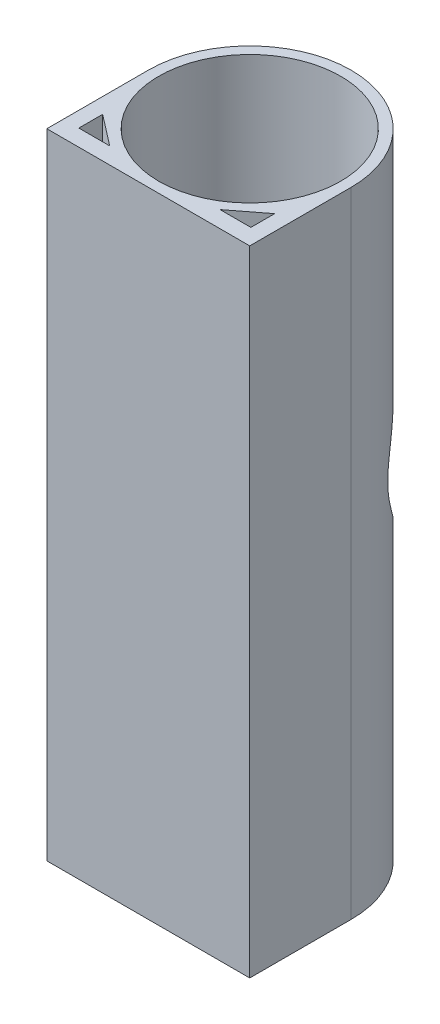
ISO-10303-21;
HEADER;
FILE_DESCRIPTION(('STEP AP214'),'2;1');
FILE_NAME('part.step','',(''),(''),'','','');
FILE_SCHEMA(('AUTOMOTIVE_DESIGN { 1 0 10303 214 1 1 1 1 }'));
ENDSEC;
DATA;
#1=APPLICATION_CONTEXT('core data for automotive mechanical design processes');
#2=APPLICATION_PROTOCOL_DEFINITION('international standard','automotive_design',2000,#1);
#3=PRODUCT_CONTEXT('',#1,'mechanical');
#4=PRODUCT('Part','Part','',(#3));
#5=PRODUCT_RELATED_PRODUCT_CATEGORY('part','',(#4));
#6=PRODUCT_DEFINITION_FORMATION('','',#4);
#7=PRODUCT_DEFINITION_CONTEXT('part definition',#1,'design');
#8=PRODUCT_DEFINITION('design','',#6,#7);
#9=PRODUCT_DEFINITION_SHAPE('','',#8);
#10=(LENGTH_UNIT() NAMED_UNIT(*) SI_UNIT(.MILLI.,.METRE.));
#11=(NAMED_UNIT(*) PLANE_ANGLE_UNIT() SI_UNIT($,.RADIAN.));
#12=(NAMED_UNIT(*) SI_UNIT($,.STERADIAN.) SOLID_ANGLE_UNIT());
#13=UNCERTAINTY_MEASURE_WITH_UNIT(LENGTH_MEASURE(1.E-05),#10,'distance_accuracy_value','');
#14=(GEOMETRIC_REPRESENTATION_CONTEXT(3) GLOBAL_UNCERTAINTY_ASSIGNED_CONTEXT((#13)) GLOBAL_UNIT_ASSIGNED_CONTEXT((#10,
#11,#12)) REPRESENTATION_CONTEXT('',''));
#15=CARTESIAN_POINT('',(0.,0.,0.));
#16=DIRECTION('',(0.,0.,1.));
#17=DIRECTION('',(1.,0.,0.));
#18=AXIS2_PLACEMENT_3D('',#15,#16,#17);
#19=CARTESIAN_POINT('',(0.,100.,0.));
#20=DIRECTION('',(0.,1.,0.));
#21=DIRECTION('',(0.,0.,1.));
#22=AXIS2_PLACEMENT_3D('',#19,#20,#21);
#23=PLANE('',#22);
#24=DIRECTION('',(1.,0.,0.));
#25=VECTOR('',#24,1.);
#26=CARTESIAN_POINT('',(-13.5669608350879,100.,13.3875277919854));
#27=LINE('',#26,#25);
#28=CARTESIAN_POINT('',(-13.5669608350879,100.,13.3875277919854));
#29=VERTEX_POINT('',#28);
#30=CARTESIAN_POINT('',(-8.70003196903027,100.,13.3875277919854));
#31=VERTEX_POINT('',#30);
#32=EDGE_CURVE('E229',#29,#31,#27,.T.);
#33=ORIENTED_EDGE('',*,*,#32,.F.);
#34=DIRECTION('',(0.,0.,1.));
#35=VECTOR('',#34,1.);
#36=CARTESIAN_POINT('',(-13.5669608350879,100.,9.63117329804829));
#37=LINE('',#36,#35);
#38=CARTESIAN_POINT('',(-13.5669608350879,100.,9.63117329804829));
#39=VERTEX_POINT('',#38);
#40=EDGE_CURVE('E226',#39,#29,#37,.T.);
#41=ORIENTED_EDGE('',*,*,#40,.F.);
#42=DIRECTION('',(-0.791635404937804,0.,-0.610993768911728));
#43=VECTOR('',#42,1.);
#44=CARTESIAN_POINT('',(-8.70003196903027,100.,13.3875277919854));
#45=LINE('',#44,#43);
#46=EDGE_CURVE('E234',#31,#39,#45,.T.);
#47=ORIENTED_EDGE('',*,*,#46,.F.);
#48=EDGE_LOOP('',(#33,#41,#47));
#49=FACE_BOUND('',#48,.T.);
#50=CARTESIAN_POINT('',(0.,100.,0.));
#51=DIRECTION('',(0.,1.,0.));
#52=DIRECTION('',(0.,0.,1.));
#53=AXIS2_PLACEMENT_3D('',#50,#51,#52);
#54=CIRCLE('',#53,16.);
#55=CARTESIAN_POINT('',(16.,100.,0.));
#56=VERTEX_POINT('',#55);
#57=CARTESIAN_POINT('',(-16.,100.,0.));
#58=VERTEX_POINT('',#57);
#59=EDGE_CURVE('E259',#56,#58,#54,.T.);
#60=ORIENTED_EDGE('',*,*,#59,.T.);
#61=DIRECTION('',(0.,0.,1.));
#62=VECTOR('',#61,1.);
#63=CARTESIAN_POINT('',(-16.,100.,16.));
#64=LINE('',#63,#62);
#65=CARTESIAN_POINT('',(-16.,100.,16.));
#66=VERTEX_POINT('',#65);
#67=EDGE_CURVE('E263',#58,#66,#64,.T.);
#68=ORIENTED_EDGE('',*,*,#67,.T.);
#69=DIRECTION('',(1.,0.,0.));
#70=VECTOR('',#69,1.);
#71=CARTESIAN_POINT('',(16.,100.,16.));
#72=LINE('',#71,#70);
#73=CARTESIAN_POINT('',(16.,100.,16.));
#74=VERTEX_POINT('',#73);
#75=EDGE_CURVE('E267',#66,#74,#72,.T.);
#76=ORIENTED_EDGE('',*,*,#75,.T.);
#77=DIRECTION('',(0.,0.,-1.));
#78=VECTOR('',#77,1.);
#79=CARTESIAN_POINT('',(16.,100.,16.));
#80=LINE('',#79,#78);
#81=EDGE_CURVE('E270',#74,#56,#80,.T.);
#82=ORIENTED_EDGE('',*,*,#81,.T.);
#83=EDGE_LOOP('',(#60,#68,#76,#82));
#84=FACE_BOUND('',#83,.T.);
#85=CARTESIAN_POINT('',(0.,100.,0.));
#86=DIRECTION('',(0.,1.,0.));
#87=DIRECTION('',(0.,0.,1.));
#88=AXIS2_PLACEMENT_3D('',#85,#86,#87);
#89=CIRCLE('',#88,14.35);
#90=CARTESIAN_POINT('',(0.,100.,14.35));
#91=VERTEX_POINT('',#90);
#92=EDGE_CURVE('E218',#91,#91,#89,.T.);
#93=ORIENTED_EDGE('',*,*,#92,.F.);
#94=EDGE_LOOP('',(#93));
#95=FACE_BOUND('',#94,.T.);
#96=DIRECTION('',(-0.791635404937804,0.,0.610993768911728));
#97=VECTOR('',#96,1.);
#98=CARTESIAN_POINT('',(8.70003196903027,100.,13.3875277919854));
#99=LINE('',#98,#97);
#100=CARTESIAN_POINT('',(13.5669608350879,100.,9.63117329804829));
#101=VERTEX_POINT('',#100);
#102=CARTESIAN_POINT('',(8.70003196903027,100.,13.3875277919854));
#103=VERTEX_POINT('',#102);
#104=EDGE_CURVE('E190',#101,#103,#99,.T.);
#105=ORIENTED_EDGE('',*,*,#104,.F.);
#106=DIRECTION('',(0.,0.,-1.));
#107=VECTOR('',#106,1.);
#108=CARTESIAN_POINT('',(13.5669608350879,100.,9.63117329804829));
#109=LINE('',#108,#107);
#110=CARTESIAN_POINT('',(13.5669608350879,100.,13.3875277919854));
#111=VERTEX_POINT('',#110);
#112=EDGE_CURVE('E187',#111,#101,#109,.T.);
#113=ORIENTED_EDGE('',*,*,#112,.F.);
#114=DIRECTION('',(1.,0.,0.));
#115=VECTOR('',#114,1.);
#116=CARTESIAN_POINT('',(13.5669608350879,100.,13.3875277919854));
#117=LINE('',#116,#115);
#118=EDGE_CURVE('E194',#103,#111,#117,.T.);
#119=ORIENTED_EDGE('',*,*,#118,.F.);
#120=EDGE_LOOP('',(#105,#113,#119));
#121=FACE_BOUND('',#120,.T.);
#122=ADVANCED_FACE('F44',(#49,#84,#95,#121),#23,.T.);
#123=CARTESIAN_POINT('',(0.,0.,0.));
#124=DIRECTION('',(0.,1.,0.));
#125=DIRECTION('',(0.,0.,1.));
#126=AXIS2_PLACEMENT_3D('',#123,#124,#125);
#127=PLANE('',#126);
#128=CARTESIAN_POINT('',(0.,0.,0.));
#129=DIRECTION('',(0.,1.,0.));
#130=DIRECTION('',(0.,0.,1.));
#131=AXIS2_PLACEMENT_3D('',#128,#129,#130);
#132=CIRCLE('',#131,14.35);
#133=CARTESIAN_POINT('',(0.,0.,14.35));
#134=VERTEX_POINT('',#133);
#135=EDGE_CURVE('E217',#134,#134,#132,.T.);
#136=ORIENTED_EDGE('',*,*,#135,.T.);
#137=EDGE_LOOP('',(#136));
#138=FACE_BOUND('',#137,.T.);
#139=DIRECTION('',(0.,0.,1.));
#140=VECTOR('',#139,1.);
#141=CARTESIAN_POINT('',(-13.5669608350879,0.,9.63117329804829));
#142=LINE('',#141,#140);
#143=CARTESIAN_POINT('',(-13.5669608350879,0.,9.63117329804829));
#144=VERTEX_POINT('',#143);
#145=CARTESIAN_POINT('',(-13.5669608350879,0.,13.3875277919854));
#146=VERTEX_POINT('',#145);
#147=EDGE_CURVE('E222',#144,#146,#142,.T.);
#148=ORIENTED_EDGE('',*,*,#147,.T.);
#149=DIRECTION('',(1.,0.,0.));
#150=VECTOR('',#149,1.);
#151=CARTESIAN_POINT('',(-13.5669608350879,0.,13.3875277919854));
#152=LINE('',#151,#150);
#153=CARTESIAN_POINT('',(-8.70003196903027,0.,13.3875277919854));
#154=VERTEX_POINT('',#153);
#155=EDGE_CURVE('E241',#146,#154,#152,.T.);
#156=ORIENTED_EDGE('',*,*,#155,.T.);
#157=DIRECTION('',(-0.791635404937804,0.,-0.610993768911728));
#158=VECTOR('',#157,1.);
#159=CARTESIAN_POINT('',(-8.70003196903027,0.,13.3875277919854));
#160=LINE('',#159,#158);
#161=EDGE_CURVE('E230',#154,#144,#160,.T.);
#162=ORIENTED_EDGE('',*,*,#161,.T.);
#163=EDGE_LOOP('',(#148,#156,#162));
#164=FACE_BOUND('',#163,.T.);
#165=CARTESIAN_POINT('',(0.,0.,0.));
#166=DIRECTION('',(0.,1.,0.));
#167=DIRECTION('',(0.,0.,1.));
#168=AXIS2_PLACEMENT_3D('',#165,#166,#167);
#169=CIRCLE('',#168,16.);
#170=CARTESIAN_POINT('',(16.,0.,0.));
#171=VERTEX_POINT('',#170);
#172=CARTESIAN_POINT('',(-16.,0.,0.));
#173=VERTEX_POINT('',#172);
#174=EDGE_CURVE('E258',#171,#173,#169,.T.);
#175=ORIENTED_EDGE('',*,*,#174,.F.);
#176=DIRECTION('',(0.,0.,-1.));
#177=VECTOR('',#176,1.);
#178=CARTESIAN_POINT('',(16.,0.,16.));
#179=LINE('',#178,#177);
#180=CARTESIAN_POINT('',(16.,0.,16.));
#181=VERTEX_POINT('',#180);
#182=EDGE_CURVE('E264',#181,#171,#179,.T.);
#183=ORIENTED_EDGE('',*,*,#182,.F.);
#184=DIRECTION('',(1.,0.,0.));
#185=VECTOR('',#184,1.);
#186=CARTESIAN_POINT('',(16.,0.,16.));
#187=LINE('',#186,#185);
#188=CARTESIAN_POINT('',(-16.,0.,16.));
#189=VERTEX_POINT('',#188);
#190=EDGE_CURVE('E280',#189,#181,#187,.T.);
#191=ORIENTED_EDGE('',*,*,#190,.F.);
#192=DIRECTION('',(0.,0.,1.));
#193=VECTOR('',#192,1.);
#194=CARTESIAN_POINT('',(-16.,0.,16.));
#195=LINE('',#194,#193);
#196=EDGE_CURVE('E277',#173,#189,#195,.T.);
#197=ORIENTED_EDGE('',*,*,#196,.F.);
#198=EDGE_LOOP('',(#175,#183,#191,#197));
#199=FACE_BOUND('',#198,.T.);
#200=DIRECTION('',(0.,0.,-1.));
#201=VECTOR('',#200,1.);
#202=CARTESIAN_POINT('',(13.5669608350879,0.,9.63117329804829));
#203=LINE('',#202,#201);
#204=CARTESIAN_POINT('',(13.5669608350879,0.,13.3875277919854));
#205=VERTEX_POINT('',#204);
#206=CARTESIAN_POINT('',(13.5669608350879,0.,9.63117329804829));
#207=VERTEX_POINT('',#206);
#208=EDGE_CURVE('E186',#205,#207,#203,.T.);
#209=ORIENTED_EDGE('',*,*,#208,.T.);
#210=DIRECTION('',(-0.791635404937804,0.,0.610993768911728));
#211=VECTOR('',#210,1.);
#212=CARTESIAN_POINT('',(8.70003196903027,0.,13.3875277919854));
#213=LINE('',#212,#211);
#214=CARTESIAN_POINT('',(8.70003196903027,0.,13.3875277919854));
#215=VERTEX_POINT('',#214);
#216=EDGE_CURVE('E201',#207,#215,#213,.T.);
#217=ORIENTED_EDGE('',*,*,#216,.T.);
#218=DIRECTION('',(1.,0.,0.));
#219=VECTOR('',#218,1.);
#220=CARTESIAN_POINT('',(13.5669608350879,0.,13.3875277919854));
#221=LINE('',#220,#219);
#222=EDGE_CURVE('E191',#215,#205,#221,.T.);
#223=ORIENTED_EDGE('',*,*,#222,.T.);
#224=EDGE_LOOP('',(#209,#217,#223));
#225=FACE_BOUND('',#224,.T.);
#226=ADVANCED_FACE('F307',(#138,#164,#199,#225),#127,.F.);
#227=CARTESIAN_POINT('',(0.,100.,0.));
#228=DIRECTION('',(0.,-1.,0.));
#229=DIRECTION('',(0.,0.,-1.));
#230=AXIS2_PLACEMENT_3D('',#227,#228,#229);
#231=CYLINDRICAL_SURFACE('',#230,16.);
#232=CARTESIAN_POINT('',(13.97,54.8665766190309,-7.79994230747894));
#233=CARTESIAN_POINT('',(13.9699985237487,55.0924436285875,-7.79994678112236));
#234=CARTESIAN_POINT('',(13.9645059640299,55.3183341278107,-7.80980728983225));
#235=CARTESIAN_POINT('',(13.9427097144403,55.7679314810345,-7.84865090592604));
#236=CARTESIAN_POINT('',(13.9264041942972,55.9916379588473,-7.87763725066971));
#237=CARTESIAN_POINT('',(13.8834081599857,56.435571176954,-7.95316616355446));
#238=CARTESIAN_POINT('',(13.8566925015884,56.6557881383162,-7.99975123056548));
#239=CARTESIAN_POINT('',(13.7935171195082,57.0910302511006,-8.10819426029293));
#240=CARTESIAN_POINT('',(13.7570531652828,57.3060531041155,-8.17005885309227));
#241=CARTESIAN_POINT('',(13.6569937133938,57.8236444650212,-8.33664386691138));
#242=CARTESIAN_POINT('',(13.5885221322852,58.1230560590729,-8.44823832362587));
#243=CARTESIAN_POINT('',(13.4345344348691,58.7092530382128,-8.69102694121135));
#244=CARTESIAN_POINT('',(13.3490085457503,58.9960310681809,-8.82223232909672));
#245=CARTESIAN_POINT('',(13.1619425924148,59.5582938902496,-9.09896936023355));
#246=CARTESIAN_POINT('',(13.0603538253724,59.8337410179924,-9.24454404995238));
#247=CARTESIAN_POINT('',(12.8422409571158,60.3731500219468,-9.54522932659498));
#248=CARTESIAN_POINT('',(12.725718066221,60.637112826573,-9.70033914022581));
#249=CARTESIAN_POINT('',(12.4061460865559,61.3050964889276,-10.1088233053283));
#250=CARTESIAN_POINT('',(12.1922318788411,61.701138817384,-10.3668079484495));
#251=CARTESIAN_POINT('',(11.7291077251626,62.4685344818749,-10.8880623607562));
#252=CARTESIAN_POINT('',(11.4798788791036,62.8398744400059,-11.151334894798));
#253=CARTESIAN_POINT('',(10.9464777037523,63.5576758990754,-11.6753716238256));
#254=CARTESIAN_POINT('',(10.6623423514044,63.9041631208136,-11.9361381629441));
#255=CARTESIAN_POINT('',(10.0586795296777,64.5715313620494,-12.4490879429243));
#256=CARTESIAN_POINT('',(9.73916787087285,64.8924237111118,-12.7012749528437));
#257=CARTESIAN_POINT('',(9.14200083802388,65.4357796991152,-13.1349520760161));
#258=CARTESIAN_POINT('',(8.87160955558304,65.6639119413956,-13.3193665785709));
#259=CARTESIAN_POINT('',(8.3095984164467,66.1021642217615,-13.677042305285));
#260=CARTESIAN_POINT('',(8.01797914218122,66.3122847536881,-13.8503038352015));
#261=CARTESIAN_POINT('',(7.41421115307583,66.7123068889453,-14.1826678748009));
#262=CARTESIAN_POINT('',(7.10209119311432,66.9022358735348,-14.3417895098838));
#263=CARTESIAN_POINT('',(6.45767416343106,67.2599239654261,-14.6432542800723));
#264=CARTESIAN_POINT('',(6.12538117215214,67.4276875323364,-14.7856007896529));
#265=CARTESIAN_POINT('',(5.5056776747206,67.7095394544941,-15.0258588918648));
#266=CARTESIAN_POINT('',(5.22145419556399,67.8278030747469,-15.1271064961066));
#267=CARTESIAN_POINT('',(4.64159151896136,68.0465806096864,-15.3149750564337));
#268=CARTESIAN_POINT('',(4.34595466754171,68.1470981486676,-15.401598998961));
#269=CARTESIAN_POINT('',(3.74475621366635,68.328979340513,-15.5587045762324));
#270=CARTESIAN_POINT('',(3.43919808362299,68.410349614346,-15.6291917906967));
#271=CARTESIAN_POINT('',(2.81987946290949,68.5527053544679,-15.7527129995874));
#272=CARTESIAN_POINT('',(2.50611888164942,68.6136905955167,-15.805746801166));
#273=CARTESIAN_POINT('',(1.87093185060101,68.714480845421,-15.8934870947554));
#274=CARTESIAN_POINT('',(1.54947365799771,68.7541722514015,-15.928095278561));
#275=CARTESIAN_POINT('',(0.903064786182122,68.8111324518246,-15.9777827877118));
#276=CARTESIAN_POINT('',(0.578114099118067,68.8284011958463,-15.9928620691431));
#277=CARTESIAN_POINT('',(-0.0724680407355863,68.8401761855407,-16.0031427137755));
#278=CARTESIAN_POINT('',(-0.398099389979445,68.8346856726972,-15.9983469076829));
#279=CARTESIAN_POINT('',(-1.04727773368454,68.8010567816269,-15.968994004122));
#280=CARTESIAN_POINT('',(-1.3708248358688,68.7729195835018,-15.944437936346));
#281=CARTESIAN_POINT('',(-1.98603295351651,68.6978587221269,-15.879016323026));
#282=CARTESIAN_POINT('',(-2.27808088232999,68.652720580978,-15.8397017959235));
#283=CARTESIAN_POINT('',(-2.85631337984338,68.5446201666632,-15.745706157139));
#284=CARTESIAN_POINT('',(-3.1424983504028,68.4816591195297,-15.6910261024489));
#285=CARTESIAN_POINT('',(-3.70741972767434,68.3388015213647,-15.5672307640638));
#286=CARTESIAN_POINT('',(-3.98615560391669,68.2589037678251,-15.4981144553983));
#287=CARTESIAN_POINT('',(-4.53483734744374,68.083200579306,-15.3465395242616));
#288=CARTESIAN_POINT('',(-4.80478267075646,67.9873941621046,-15.2640800779756));
#289=CARTESIAN_POINT('',(-5.35305085050942,67.7738669732234,-15.0809160026481));
#290=CARTESIAN_POINT('',(-5.63067354105304,67.6550923614836,-14.9793467170727));
#291=CARTESIAN_POINT('',(-6.17380991477573,67.4019186073852,-14.7637898083503));
#292=CARTESIAN_POINT('',(-6.43931879578762,67.2675133423653,-14.6497973200347));
#293=CARTESIAN_POINT('',(-6.95752030035005,66.9843735955445,-14.4109098678718));
#294=CARTESIAN_POINT('',(-7.21021075202144,66.8356366977726,-14.2860130661521));
#295=CARTESIAN_POINT('',(-7.70235917723859,66.5250186959574,-14.0267977819284));
#296=CARTESIAN_POINT('',(-7.94181440150156,66.3631348780916,-13.8924773549573));
#297=CARTESIAN_POINT('',(-8.52725760670458,65.9406886237687,-13.5445250281677));
#298=CARTESIAN_POINT('',(-8.86453826838918,65.6722725481025,-13.3256990621171));
#299=CARTESIAN_POINT('',(-9.50803408132681,65.1106356857059,-12.874464779812));
#300=CARTESIAN_POINT('',(-9.81423474779551,64.8174034491217,-12.6420502094091));
#301=CARTESIAN_POINT('',(-10.3964281123429,64.2075280371138,-12.167808869214));
#302=CARTESIAN_POINT('',(-10.6723411292202,63.8908266156015,-11.925959438862));
#303=CARTESIAN_POINT('',(-11.1932906211576,63.235938902689,-11.4384183242691));
#304=CARTESIAN_POINT('',(-11.4383353821597,62.8977584137186,-11.1927276911102));
#305=CARTESIAN_POINT('',(-11.863615531859,62.2518321509213,-10.7394761000152));
#306=CARTESIAN_POINT('',(-12.0480711843244,61.947025689152,-10.5316715270431));
#307=CARTESIAN_POINT('',(-12.3946155699113,61.321217658118,-10.1215380116039));
#308=CARTESIAN_POINT('',(-12.5566984156489,61.0002118562441,-9.91921052164352));
#309=CARTESIAN_POINT('',(-12.8573920240015,60.3418865450607,-9.52620044676728));
#310=CARTESIAN_POINT('',(-12.9960666887165,60.0046147904269,-9.33548709819877));
#311=CARTESIAN_POINT('',(-13.2491313195712,59.3115015438118,-8.97269636527639));
#312=CARTESIAN_POINT('',(-13.3635418269399,58.9556760793305,-8.80060327857907));
#313=CARTESIAN_POINT('',(-13.5192852169626,58.3924470548835,-8.55799292356975));
#314=CARTESIAN_POINT('',(-13.5700251137269,58.1920589169846,-8.47716467055808));
#315=CARTESIAN_POINT('',(-13.6632697369306,57.7853918459385,-8.32603894018462));
#316=CARTESIAN_POINT('',(-13.7057734485503,57.5791121904575,-8.25574276077162));
#317=CARTESIAN_POINT('',(-13.7818581763614,57.1614064134984,-8.12809401831235));
#318=CARTESIAN_POINT('',(-13.8154572952183,56.9499917021535,-8.07071523108295));
#319=CARTESIAN_POINT('',(-13.8731946223363,56.522433527169,-7.9710600766854));
#320=CARTESIAN_POINT('',(-13.8973379230578,56.3062926752152,-7.92877558152857));
#321=CARTESIAN_POINT('',(-13.93585205876,55.8675864731154,-7.86088990594276));
#322=CARTESIAN_POINT('',(-13.9500912406658,55.6449740917875,-7.83551366227693));
#323=CARTESIAN_POINT('',(-13.9678593737539,55.1979689882716,-7.80379685605576));
#324=CARTESIAN_POINT('',(-13.9713893441311,54.9735764375403,-7.79745448204912));
#325=CARTESIAN_POINT('',(-13.9676269381772,54.5251217303862,-7.80419187902652));
#326=CARTESIAN_POINT('',(-13.9603318563038,54.3010596705758,-7.81727650546766));
#327=CARTESIAN_POINT('',(-13.9351460344971,53.8554156504792,-7.86208296274734));
#328=CARTESIAN_POINT('',(-13.9172536324632,53.6338340847936,-7.89380771712709));
#329=CARTESIAN_POINT('',(-13.8683443116966,53.1658920326252,-7.97945854641507));
#330=CARTESIAN_POINT('',(-13.8359073891607,52.9201188577043,-8.03576131229411));
#331=CARTESIAN_POINT('',(-13.7590086064501,52.4353396307637,-8.16672649754281));
#332=CARTESIAN_POINT('',(-13.7145372606204,52.1963390818622,-8.24140339535801));
#333=CARTESIAN_POINT('',(-13.614366079972,51.7252186040775,-8.40584989627242));
#334=CARTESIAN_POINT('',(-13.5586319881543,51.4931222073129,-8.49566540355366));
#335=CARTESIAN_POINT('',(-13.4368497024039,51.0367284336349,-8.68699935857534));
#336=CARTESIAN_POINT('',(-13.3708036520346,50.8124294476821,-8.788515372967));
#337=CARTESIAN_POINT('',(-13.1769149988526,50.2091597030578,-9.07841567705476));
#338=CARTESIAN_POINT('',(-13.0393238468543,49.8376383641723,-9.27582046265858));
#339=CARTESIAN_POINT('',(-12.7370920217076,49.1149775473517,-9.68667898399853));
#340=CARTESIAN_POINT('',(-12.572431762809,48.7638530783003,-9.90014427915332));
#341=CARTESIAN_POINT('',(-12.2168692812574,48.0799963049422,-10.3357286694537));
#342=CARTESIAN_POINT('',(-12.0259300112514,47.7472909126288,-10.5578596587123));
#343=CARTESIAN_POINT('',(-11.618416915875,47.10001473723,-11.0047203908324));
#344=CARTESIAN_POINT('',(-11.4018496829152,46.7854393213061,-11.2294494520156));
#345=CARTESIAN_POINT('',(-10.9261657070748,46.1517586523117,-11.6934710299282));
#346=CARTESIAN_POINT('',(-10.6650930166857,45.8340140881873,-11.9326224773466));
#347=CARTESIAN_POINT('',(-10.1130128879351,45.219901611606,-12.403981950058));
#348=CARTESIAN_POINT('',(-9.82199991345452,44.9235376698376,-12.6361886809536));
#349=CARTESIAN_POINT('',(-9.21044146050283,44.3545483202183,-13.0886276613958));
#350=CARTESIAN_POINT('',(-8.88995753617431,44.0818756481531,-13.3088834072602));
#351=CARTESIAN_POINT('',(-8.21900347175719,43.5622066876207,-13.7333697034885));
#352=CARTESIAN_POINT('',(-7.86854473843176,43.3152007103811,-13.9376062936405));
#353=CARTESIAN_POINT('',(-7.23440171432464,42.9114088375188,-14.2743207844099));
#354=CARTESIAN_POINT('',(-6.95743233242275,42.7479922878497,-14.411533537116));
#355=CARTESIAN_POINT('',(-6.38807694853747,42.4384507418406,-14.6727815150905));
#356=CARTESIAN_POINT('',(-6.09569479730928,42.2923214557402,-14.7968200087107));
#357=CARTESIAN_POINT('',(-5.49642785583765,42.0190637004562,-15.0297234122854));
#358=CARTESIAN_POINT('',(-5.18954684784018,41.8919303115348,-15.1385922505269));
#359=CARTESIAN_POINT('',(-4.5625294460352,41.6583925226535,-15.3392194812548));
#360=CARTESIAN_POINT('',(-4.24239281673994,41.5519884911451,-15.4309775696071));
#361=CARTESIAN_POINT('',(-3.58787448301018,41.3608268982949,-15.596218921834));
#362=CARTESIAN_POINT('',(-3.25339308401562,41.2762656974877,-15.6695362643456));
#363=CARTESIAN_POINT('',(-2.5752720684636,41.1316197003414,-15.795152873488));
#364=CARTESIAN_POINT('',(-2.23163242480648,41.0715349764378,-15.8474520779178));
#365=CARTESIAN_POINT('',(-1.53841360081086,40.9771397035447,-15.9296899117799));
#366=CARTESIAN_POINT('',(-1.18883869826747,40.9428113352679,-15.9596440003833));
#367=CARTESIAN_POINT('',(-0.486901684470016,40.9006396063938,-15.9964492242683));
#368=CARTESIAN_POINT('',(-0.134539947893376,40.8927927441685,-16.0033034140307));
#369=CARTESIAN_POINT('',(0.523095212825208,40.9030243744725,-15.9943706747698));
#370=CARTESIAN_POINT('',(0.828466986348987,40.9178290396171,-15.9814428194347));
#371=CARTESIAN_POINT('',(1.43634240974366,40.9672679214958,-15.9383102874493));
#372=CARTESIAN_POINT('',(1.73884635714854,41.001900057748,-15.908107423453));
#373=CARTESIAN_POINT('',(2.33885607285869,41.0904148625043,-15.831022100193));
#374=CARTESIAN_POINT('',(2.63636174142932,41.1442979146606,-15.7841393085143));
#375=CARTESIAN_POINT('',(3.22447194452947,41.2704690513937,-15.6745737692118));
#376=CARTESIAN_POINT('',(3.51507617900077,41.3427579346172,-15.6118903359841));
#377=CARTESIAN_POINT('',(4.08652380060879,41.5043528415147,-15.4721196889334));
#378=CARTESIAN_POINT('',(4.36740363543095,41.5935847205505,-15.3950952605897));
#379=CARTESIAN_POINT('',(4.91940665544622,41.7881216004897,-15.2276928982398));
#380=CARTESIAN_POINT('',(5.19053017975778,41.8934260420608,-15.1373154289289));
#381=CARTESIAN_POINT('',(5.72211334385636,42.1189610457946,-14.9444765943681));
#382=CARTESIAN_POINT('',(5.98257060206096,42.2391949175227,-14.8420125500116));
#383=CARTESIAN_POINT('',(6.49208526350863,42.4934271052015,-14.6263257311132));
#384=CARTESIAN_POINT('',(6.74114030699685,42.6274282519213,-14.5131007443119));
#385=CARTESIAN_POINT('',(7.3385706697874,42.9723082585406,-14.2232346532805));
#386=CARTESIAN_POINT('',(7.6802796800818,43.1903197320127,-14.0412720467843));
#387=CARTESIAN_POINT('',(8.33765257265468,43.6502703808158,-13.6611799463338));
#388=CARTESIAN_POINT('',(8.65330618006666,43.8922189137427,-13.4630441352061));
#389=CARTESIAN_POINT('',(9.25893017206803,44.3980942699205,-13.0539653001227));
#390=CARTESIAN_POINT('',(9.54884373812664,44.6620673368613,-12.8429955944363));
#391=CARTESIAN_POINT('',(10.1022902984686,45.2096526429737,-12.412358908831));
#392=CARTESIAN_POINT('',(10.3658266840281,45.4932623495383,-12.1926930520447));
#393=CARTESIAN_POINT('',(10.8718767759482,46.0849022168444,-11.7438897551186));
#394=CARTESIAN_POINT('',(11.1138576410886,46.3933102124244,-11.5146506092963));
#395=CARTESIAN_POINT('',(11.5709165570147,47.0289687508808,-11.0552634264004));
#396=CARTESIAN_POINT('',(11.7859879960215,47.3562238958641,-10.8251151802297));
#397=CARTESIAN_POINT('',(12.188853185939,48.0294351220579,-10.3693885999982));
#398=CARTESIAN_POINT('',(12.3766792174826,48.3753683949286,-10.1438051349133));
#399=CARTESIAN_POINT('',(12.7247384809532,49.0873965231637,-9.70358335261692));
#400=CARTESIAN_POINT('',(12.8849875877664,49.4534796178261,-9.48893878876788));
#401=CARTESIAN_POINT('',(13.1142459000116,50.0467174555882,-9.16719090673611));
#402=CARTESIAN_POINT('',(13.1929988360701,50.266455998477,-9.05329949818793));
#403=CARTESIAN_POINT('',(13.3405380233802,50.7136965119809,-8.834445517338));
#404=CARTESIAN_POINT('',(13.4093228988567,50.9411995488953,-8.72948417837365));
#405=CARTESIAN_POINT('',(13.5361317875038,51.4037149261958,-8.53152598204785));
#406=CARTESIAN_POINT('',(13.5941781939631,51.6387104138526,-8.43850435341384));
#407=CARTESIAN_POINT('',(13.6988591835146,52.116674785992,-8.26748591107668));
#408=CARTESIAN_POINT('',(13.7454944912859,52.3596431630323,-8.18948814332748));
#409=CARTESIAN_POINT('',(13.8158582298483,52.7887916843785,-8.07004009483753));
#410=CARTESIAN_POINT('',(13.8423903448184,52.9733352821218,-8.02435878714759));
#411=CARTESIAN_POINT('',(13.8882389720679,53.3457591230103,-7.94474255589521));
#412=CARTESIAN_POINT('',(13.9075591625002,53.5336376139673,-7.91080164526356));
#413=CARTESIAN_POINT('',(13.9386176235174,53.9117135188407,-7.85594939547671));
#414=CARTESIAN_POINT('',(13.9503644254483,54.1019080766765,-7.83502339609701));
#415=CARTESIAN_POINT('',(13.9660551937915,54.4835885740747,-7.80701981153385));
#416=CARTESIAN_POINT('',(13.970001251647,54.6750741536849,-7.79993851447816));
#417=CARTESIAN_POINT('',(13.97,54.8665766190309,-7.79994230747894));
#418=B_SPLINE_CURVE_WITH_KNOTS('',3,(#232,#233,#234,#235,#236,#237,#238,#239,#240,#241,#242,
#243,#244,#245,#246,#247,#248,#249,#250,#251,#252,#253,#254,#255,#256,#257,#258,#259,#260,#261,
#262,#263,#264,#265,#266,#267,#268,#269,#270,#271,#272,#273,#274,#275,#276,#277,#278,#279,#280,
#281,#282,#283,#284,#285,#286,#287,#288,#289,#290,#291,#292,#293,#294,#295,#296,#297,#298,#299,
#300,#301,#302,#303,#304,#305,#306,#307,#308,#309,#310,#311,#312,#313,#314,#315,#316,#317,#318,
#319,#320,#321,#322,#323,#324,#325,#326,#327,#328,#329,#330,#331,#332,#333,#334,#335,#336,#337,
#338,#339,#340,#341,#342,#343,#344,#345,#346,#347,#348,#349,#350,#351,#352,#353,#354,#355,#356,
#357,#358,#359,#360,#361,#362,#363,#364,#365,#366,#367,#368,#369,#370,#371,#372,#373,#374,#375,
#376,#377,#378,#379,#380,#381,#382,#383,#384,#385,#386,#387,#388,#389,#390,#391,#392,#393,#394,
#395,#396,#397,#398,#399,#400,#401,#402,#403,#404,#405,#406,#407,#408,#409,#410,#411,#412,#413,
#414,#415,#416,#417),.UNSPECIFIED.,.T.,.F.,(4,2,2,2,2,2,2,2,2,2,2,2,2,2,2,2,2,2,2,2,2,2,2,2,2,2,
2,2,2,2,2,2,2,2,2,2,2,2,2,2,2,2,2,2,2,2,2,2,2,2,2,2,2,2,2,2,2,2,2,2,2,2,2,2,2,2,2,2,2,2,2,2,2,2,
2,2,2,2,2,2,2,2,2,2,2,2,2,2,2,2,2,2,4),(0.,0.677369040394245,1.35485276597213,2.03398310410921,
2.71340864941681,3.69210572072239,4.67136524530509,5.65365293525512,6.63586106708151,
8.19019438411331,9.74536273142161,11.2988976471813,12.8517410300091,14.047594897536,
15.2434159669128,16.4375941527123,17.6315317067583,18.6028042474654,19.573878194465,
20.5446158569084,21.515364244955,22.4912413460326,23.467120641519,24.4428609523227,
25.4185504213286,26.3119118861247,27.2052119117802,28.0985753830964,28.9919940323712,
29.9468416748472,30.9020646072057,31.8574488500003,32.8130308095025,34.2611612305584,
35.7099634813214,37.1624902614953,38.6146263064094,39.8510947076671,41.0878878666844,
42.3212480913742,43.5535599892213,44.2190302470375,44.8845824485548,45.548771046955,
46.2126014510119,46.8850955267112,47.5575255991928,48.2301237627308,48.902827445584,
49.6642739581692,50.4263224076631,51.1907245840099,51.9549680738845,53.2807613149212,
54.6075180851585,55.9361648103309,57.2644705008876,58.6902223101725,60.1162382240334,
61.5393405741988,62.9619037591058,64.0099011591074,65.0576379551183,66.1051029261999,
67.1525865136171,68.2091824291551,69.2657814715535,70.321648840291,71.3773765870767,
72.2942613958318,73.2110500141719,74.1278569042502,75.0447035822429,75.9576268291413,
76.8705183131362,77.7836125299783,78.6968948705712,80.0278372991658,81.3593020979479,
82.6936364634413,84.0277990545236,85.3889390961631,86.7504129226041,88.1102602495711,
89.4693221312989,90.2481346854443,91.0270546278513,91.804331487615,92.5815589724158,
93.1569665785573,93.7320803188618,94.3065450620804,94.880855765707),.UNSPECIFIED.);
#419=CARTESIAN_POINT('',(13.97,54.8665766190309,-7.79994230747894));
#420=VERTEX_POINT('',#419);
#421=EDGE_CURVE('E179',#420,#420,#418,.T.);
#422=ORIENTED_EDGE('',*,*,#421,.T.);
#423=EDGE_LOOP('',(#422));
#424=FACE_BOUND('',#423,.T.);
#425=ORIENTED_EDGE('',*,*,#174,.T.);
#426=DIRECTION('',(0.,-1.,0.));
#427=VECTOR('',#426,1.);
#428=CARTESIAN_POINT('',(-16.,100.,0.));
#429=LINE('',#428,#427);
#430=EDGE_CURVE('E139',#58,#173,#429,.T.);
#431=ORIENTED_EDGE('',*,*,#430,.F.);
#432=ORIENTED_EDGE('',*,*,#59,.F.);
#433=DIRECTION('',(0.,-1.,0.));
#434=VECTOR('',#433,1.);
#435=CARTESIAN_POINT('',(16.,100.,0.));
#436=LINE('',#435,#434);
#437=EDGE_CURVE('E273',#56,#171,#436,.T.);
#438=ORIENTED_EDGE('',*,*,#437,.T.);
#439=EDGE_LOOP('',(#425,#431,#432,#438));
#440=FACE_BOUND('',#439,.T.);
#441=ADVANCED_FACE('F46',(#424,#440),#231,.T.);
#442=CARTESIAN_POINT('',(-16.,100.,16.));
#443=DIRECTION('',(1.,0.,0.));
#444=DIRECTION('',(0.,0.,-1.));
#445=AXIS2_PLACEMENT_3D('',#442,#443,#444);
#446=PLANE('',#445);
#447=ORIENTED_EDGE('',*,*,#196,.T.);
#448=DIRECTION('',(0.,-1.,0.));
#449=VECTOR('',#448,1.);
#450=CARTESIAN_POINT('',(-16.,100.,16.));
#451=LINE('',#450,#449);
#452=EDGE_CURVE('E292',#66,#189,#451,.T.);
#453=ORIENTED_EDGE('',*,*,#452,.F.);
#454=ORIENTED_EDGE('',*,*,#67,.F.);
#455=ORIENTED_EDGE('',*,*,#430,.T.);
#456=EDGE_LOOP('',(#447,#453,#454,#455));
#457=FACE_BOUND('',#456,.T.);
#458=ADVANCED_FACE('F299',(#457),#446,.F.);
#459=CARTESIAN_POINT('',(16.,100.,16.));
#460=DIRECTION('',(0.,0.,-1.));
#461=DIRECTION('',(-1.,0.,0.));
#462=AXIS2_PLACEMENT_3D('',#459,#460,#461);
#463=PLANE('',#462);
#464=ORIENTED_EDGE('',*,*,#190,.T.);
#465=DIRECTION('',(0.,-1.,0.));
#466=VECTOR('',#465,1.);
#467=CARTESIAN_POINT('',(16.,100.,16.));
#468=LINE('',#467,#466);
#469=EDGE_CURVE('E288',#74,#181,#468,.T.);
#470=ORIENTED_EDGE('',*,*,#469,.F.);
#471=ORIENTED_EDGE('',*,*,#75,.F.);
#472=ORIENTED_EDGE('',*,*,#452,.T.);
#473=EDGE_LOOP('',(#464,#470,#471,#472));
#474=FACE_BOUND('',#473,.T.);
#475=ADVANCED_FACE('F312',(#474),#463,.F.);
#476=CARTESIAN_POINT('',(16.,100.,16.));
#477=DIRECTION('',(-1.,0.,0.));
#478=DIRECTION('',(0.,0.,1.));
#479=AXIS2_PLACEMENT_3D('',#476,#477,#478);
#480=PLANE('',#479);
#481=ORIENTED_EDGE('',*,*,#182,.T.);
#482=ORIENTED_EDGE('',*,*,#437,.F.);
#483=ORIENTED_EDGE('',*,*,#81,.F.);
#484=ORIENTED_EDGE('',*,*,#469,.T.);
#485=EDGE_LOOP('',(#481,#482,#483,#484));
#486=FACE_BOUND('',#485,.T.);
#487=ADVANCED_FACE('F316',(#486),#480,.F.);
#488=CARTESIAN_POINT('',(-13.5669608350879,100.,9.63117329804829));
#489=DIRECTION('',(1.,0.,0.));
#490=DIRECTION('',(0.,0.,-1.));
#491=AXIS2_PLACEMENT_3D('',#488,#489,#490);
#492=PLANE('',#491);
#493=ORIENTED_EDGE('',*,*,#147,.F.);
#494=DIRECTION('',(0.,-1.,0.));
#495=VECTOR('',#494,1.);
#496=CARTESIAN_POINT('',(-13.5669608350879,100.,9.63117329804829));
#497=LINE('',#496,#495);
#498=EDGE_CURVE('E237',#39,#144,#497,.T.);
#499=ORIENTED_EDGE('',*,*,#498,.F.);
#500=ORIENTED_EDGE('',*,*,#40,.T.);
#501=DIRECTION('',(0.,-1.,0.));
#502=VECTOR('',#501,1.);
#503=CARTESIAN_POINT('',(-13.5669608350879,100.,13.3875277919854));
#504=LINE('',#503,#502);
#505=EDGE_CURVE('E254',#29,#146,#504,.T.);
#506=ORIENTED_EDGE('',*,*,#505,.T.);
#507=EDGE_LOOP('',(#493,#499,#500,#506));
#508=FACE_BOUND('',#507,.T.);
#509=ADVANCED_FACE('F353',(#508),#492,.T.);
#510=CARTESIAN_POINT('',(-13.5669608350879,100.,13.3875277919854));
#511=DIRECTION('',(0.,0.,-1.));
#512=DIRECTION('',(-1.,0.,0.));
#513=AXIS2_PLACEMENT_3D('',#510,#511,#512);
#514=PLANE('',#513);
#515=ORIENTED_EDGE('',*,*,#155,.F.);
#516=ORIENTED_EDGE('',*,*,#505,.F.);
#517=ORIENTED_EDGE('',*,*,#32,.T.);
#518=DIRECTION('',(0.,-1.,0.));
#519=VECTOR('',#518,1.);
#520=CARTESIAN_POINT('',(-8.70003196903027,100.,13.3875277919854));
#521=LINE('',#520,#519);
#522=EDGE_CURVE('E251',#31,#154,#521,.T.);
#523=ORIENTED_EDGE('',*,*,#522,.T.);
#524=EDGE_LOOP('',(#515,#516,#517,#523));
#525=FACE_BOUND('',#524,.T.);
#526=ADVANCED_FACE('F348',(#525),#514,.T.);
#527=CARTESIAN_POINT('',(-8.70003196903027,100.,13.3875277919854));
#528=DIRECTION('',(-0.610993768911728,0.,0.791635404937804));
#529=DIRECTION('',(0.791635404937804,0.,0.610993768911728));
#530=AXIS2_PLACEMENT_3D('',#527,#528,#529);
#531=PLANE('',#530);
#532=ORIENTED_EDGE('',*,*,#161,.F.);
#533=ORIENTED_EDGE('',*,*,#522,.F.);
#534=ORIENTED_EDGE('',*,*,#46,.T.);
#535=ORIENTED_EDGE('',*,*,#498,.T.);
#536=EDGE_LOOP('',(#532,#533,#534,#535));
#537=FACE_BOUND('',#536,.T.);
#538=ADVANCED_FACE('F345',(#537),#531,.T.);
#539=CARTESIAN_POINT('',(0.,100.,0.));
#540=DIRECTION('',(0.,-1.,0.));
#541=DIRECTION('',(0.,0.,-1.));
#542=AXIS2_PLACEMENT_3D('',#539,#540,#541);
#543=CYLINDRICAL_SURFACE('',#542,14.35);
#544=DIRECTION('',(0.,-1.,0.));
#545=VECTOR('',#544,1.);
#546=CARTESIAN_POINT('',(-13.7812372448921,100.,-3.99999999999997));
#547=LINE('',#546,#545);
#548=CARTESIAN_POINT('',(-13.7812372448921,57.155331739178,-3.99999999999997));
#549=VERTEX_POINT('',#548);
#550=CARTESIAN_POINT('',(-13.7812372448921,52.5778214988837,-3.99999999999997));
#551=VERTEX_POINT('',#550);
#552=EDGE_CURVE('E11',#549,#551,#547,.T.);
#553=ORIENTED_EDGE('',*,*,#552,.F.);
#554=CARTESIAN_POINT('',(13.7812372448921,57.155331739178,-3.99999999999997));
#555=CARTESIAN_POINT('',(13.7599094160163,57.2836805748304,-4.07352261060654));
#556=CARTESIAN_POINT('',(13.7370880640914,57.4100701198702,-4.14991325438915));
#557=CARTESIAN_POINT('',(13.6885853819899,57.6593773323339,-4.30718058042114));
#558=CARTESIAN_POINT('',(13.662905586776,57.7822968191187,-4.38805484340029));
#559=CARTESIAN_POINT('',(13.6088291948883,58.025070944587,-4.55300113054606));
#560=CARTESIAN_POINT('',(13.5804365829115,58.1449297604609,-4.63706835856527));
#561=CARTESIAN_POINT('',(13.5209619445917,58.3821765149834,-4.80772903979483));
#562=CARTESIAN_POINT('',(13.4898795052722,58.499564070761,-4.89432287956509));
#563=CARTESIAN_POINT('',(13.3927769245575,58.84810997317,-5.15661578499412));
#564=CARTESIAN_POINT('',(13.3228076401342,59.0760690307369,-5.33511626863501));
#565=CARTESIAN_POINT('',(13.1724503583181,59.5252803913816,-5.6962618712628));
#566=CARTESIAN_POINT('',(13.092057879552,59.7465297588993,-5.87890874493378));
#567=CARTESIAN_POINT('',(12.9199943466208,60.1854834371373,-6.24805061287457));
#568=CARTESIAN_POINT('',(12.828217349593,60.4031291819767,-6.43456584503284));
#569=CARTESIAN_POINT('',(12.6339634874561,60.8331082982269,-6.80806784643348));
#570=CARTESIAN_POINT('',(12.5314882056714,61.0454424499927,-6.99505454191422));
#571=CARTESIAN_POINT('',(12.3156343019408,61.4651950121287,-7.36845836757975));
#572=CARTESIAN_POINT('',(12.2022512934889,61.6726114026907,-7.55487523725535));
#573=CARTESIAN_POINT('',(11.964442592829,62.0824713250708,-7.92611008724348));
#574=CARTESIAN_POINT('',(11.8400167469623,62.2849147876417,-8.11092804526822));
#575=CARTESIAN_POINT('',(11.4810461769057,62.8366935587508,-8.61770724683096));
#576=CARTESIAN_POINT('',(11.2346720565339,63.1807504245166,-8.93716003309141));
#577=CARTESIAN_POINT('',(10.7058577314296,63.85144188039,-9.56427646825345));
#578=CARTESIAN_POINT('',(10.4234210354202,64.1780781610634,-9.87194126029178));
#579=CARTESIAN_POINT('',(9.82245470303597,64.8098957400191,-10.4699986294111));
#580=CARTESIAN_POINT('',(9.50407815700328,65.1151596896675,-10.7604569895206));
#581=CARTESIAN_POINT('',(8.82937056571875,65.7018323388422,-11.3206357852526));
#582=CARTESIAN_POINT('',(8.47305652984479,65.9832516283996,-11.5903654220353));
#583=CARTESIAN_POINT('',(7.84786160759624,66.4279747701579,-12.0177004267878));
#584=CARTESIAN_POINT('',(7.58962815227964,66.5992881886821,-12.1826195856821));
#585=CARTESIAN_POINT('',(7.05634886301764,66.9275397819652,-12.4990610151238));
#586=CARTESIAN_POINT('',(6.78130580849903,67.0844803225806,-12.6505854903682));
#587=CARTESIAN_POINT('',(6.21480704964211,67.3821451864252,-12.9382998034055));
#588=CARTESIAN_POINT('',(5.92334947146502,67.5228676526329,-13.0744878850916));
#589=CARTESIAN_POINT('',(5.32490280449427,67.7860635938384,-13.3294288837338));
#590=CARTESIAN_POINT('',(5.01791320931398,67.9085364733351,-13.4481812317438));
#591=CARTESIAN_POINT('',(4.38648509622726,68.1343279822465,-13.6672627857502));
#592=CARTESIAN_POINT('',(4.06189656195281,68.2374307066842,-13.7673842213677));
#593=CARTESIAN_POINT('',(3.40036412762168,68.4207715638454,-13.9455128736832));
#594=CARTESIAN_POINT('',(3.06342017001437,68.5010095900516,-14.0235199873597));
#595=CARTESIAN_POINT('',(2.38032650293632,68.6366911236058,-14.1554725840976));
#596=CARTESIAN_POINT('',(2.03418750233069,68.6921622402573,-14.2094448601978));
#597=CARTESIAN_POINT('',(1.33575182048467,68.777016469901,-14.2920201721326));
#598=CARTESIAN_POINT('',(0.983456329026912,68.8064045679803,-14.3206280557068));
#599=CARTESIAN_POINT('',(0.330177357043243,68.8359016438218,-14.3493426243862));
#600=CARTESIAN_POINT('',(0.0295144814416362,68.8397749692488,-14.3531136277101));
#601=CARTESIAN_POINT('',(-0.571056137044162,68.8281296126684,-14.3417767300373));
#602=CARTESIAN_POINT('',(-0.870963965563744,68.8126132391708,-14.3266710764685));
#603=CARTESIAN_POINT('',(-1.46762889684184,68.7624972475557,-14.2778912074172));
#604=CARTESIAN_POINT('',(-1.76438612498497,68.7278983917882,-14.2442177337238));
#605=CARTESIAN_POINT('',(-2.35255089316846,68.6402766408898,-14.1589657073789));
#606=CARTESIAN_POINT('',(-2.64395832224739,68.5872533640673,-14.107386783787));
#607=CARTESIAN_POINT('',(-3.20490717705722,68.4668550363059,-13.9903175780249));
#608=CARTESIAN_POINT('',(-3.47480951120492,68.400340396688,-13.9256617701115));
#609=CARTESIAN_POINT('',(-4.00672806763523,68.25251186406,-13.7820374391701));
#610=CARTESIAN_POINT('',(-4.26874131832029,68.1711924738128,-13.7030635996768));
#611=CARTESIAN_POINT('',(-4.78363122051366,67.9948598009966,-13.531924034838));
#612=CARTESIAN_POINT('',(-5.03650898130357,67.8998481880502,-13.4397599179175));
#613=CARTESIAN_POINT('',(-5.53235826678858,67.6972306048442,-13.2433629335445));
#614=CARTESIAN_POINT('',(-5.77532773178043,67.5896220337849,-13.1391275738806));
#615=CARTESIAN_POINT('',(-6.35257890999594,67.3143511013975,-12.8727239942552));
#616=CARTESIAN_POINT('',(-6.68140601661363,67.1407056185131,-12.7048623074844));
#617=CARTESIAN_POINT('',(-7.31657274503802,66.7730222748532,-12.3500092878637));
#618=CARTESIAN_POINT('',(-7.6229047266596,66.5789775396414,-12.1630115068225));
#619=CARTESIAN_POINT('',(-8.21326171921203,66.1728514378735,-11.7724398731631));
#620=CARTESIAN_POINT('',(-8.49724035407468,65.9607343807206,-11.5688332555404));
#621=CARTESIAN_POINT('',(-9.04225860669124,65.5212021844436,-11.1480322018039));
#622=CARTESIAN_POINT('',(-9.30329757874449,65.2937866150182,-10.9308373835068));
#623=CARTESIAN_POINT('',(-9.89563225651068,64.7386495448659,-10.4023890000861));
#624=CARTESIAN_POINT('',(-10.2170079283463,64.405047102821,-10.08616480093));
#625=CARTESIAN_POINT('',(-10.8186807029047,63.7167821052017,-9.43791786378578));
#626=CARTESIAN_POINT('',(-11.0989627766129,63.3621119108982,-9.10588940427803));
#627=CARTESIAN_POINT('',(-11.619931239805,62.6343575539109,-8.43098188659612));
#628=CARTESIAN_POINT('',(-11.8606056930775,62.2612678841814,-8.08809959447829));
#629=CARTESIAN_POINT('',(-12.3036510127965,61.4980144649222,-7.3966896475127));
#630=CARTESIAN_POINT('',(-12.506023201932,61.1078513055632,-7.04816218806045));
#631=CARTESIAN_POINT('',(-12.8158495319622,60.4348521541766,-6.46138688602267));
#632=CARTESIAN_POINT('',(-12.933162567224,60.1567509082115,-6.2228485938683));
#633=CARTESIAN_POINT('',(-13.1503903142341,59.5909851425026,-5.74954754860692));
#634=CARTESIAN_POINT('',(-13.2503176915811,59.3033277679705,-5.51478216103506));
#635=CARTESIAN_POINT('',(-13.3870198147922,58.8630808354769,-5.16967206444412));
#636=CARTESIAN_POINT('',(-13.430329804986,58.7151171374433,-5.05598590991136));
#637=CARTESIAN_POINT('',(-13.5125712216317,58.4155819280674,-4.8318897098665));
#638=CARTESIAN_POINT('',(-13.5515037085889,58.2640113013768,-4.72147887565906));
#639=CARTESIAN_POINT('',(-13.6249821821642,57.9562225589278,-4.50503803831993));
#640=CARTESIAN_POINT('',(-13.6595193212484,57.7999958267736,-4.3990171523094));
#641=CARTESIAN_POINT('',(-13.723936069352,57.4820285138098,-4.19379212498686));
#642=CARTESIAN_POINT('',(-13.7538117548788,57.3202834263046,-4.09459376496571));
#643=CARTESIAN_POINT('',(-13.7812372448921,57.155331739178,-3.99999999999996));
#644=B_SPLINE_CURVE_WITH_KNOTS('',3,(#554,#555,#556,#557,#558,#559,#560,#561,#562,#563,#564,
#565,#566,#567,#568,#569,#570,#571,#572,#573,#574,#575,#576,#577,#578,#579,#580,#581,#582,#583,
#584,#585,#586,#587,#588,#589,#590,#591,#592,#593,#594,#595,#596,#597,#598,#599,#600,#601,#602,
#603,#604,#605,#606,#607,#608,#609,#610,#611,#612,#613,#614,#615,#616,#617,#618,#619,#620,#621,
#622,#623,#624,#625,#626,#627,#628,#629,#630,#631,#632,#633,#634,#635,#636,#637,#638,#639,#640,
#641,#642,#643),.UNSPECIFIED.,.F.,.F.,(4,2,2,2,2,2,2,2,2,2,2,2,2,2,2,2,2,2,2,2,2,2,2,2,2,2,2,2,
2,2,2,2,2,2,2,2,2,2,2,2,2,2,2,2,4),(0.,0.448203504013435,0.896167476753531,1.34348329109004,
1.79086790529008,2.68408841529823,3.57769424012992,4.48034678429759,5.38286592660366,
6.28574954335817,7.18864572550558,8.77765823057773,10.36651624966,11.9488449966938,
13.5304672661477,14.5827671442309,15.6348934953443,16.6871401988521,17.7394212306411,
18.8028133193936,19.8662103619756,20.9284189879227,21.9904245567112,22.8913755003808,
23.7922191883356,24.6930268899568,25.5938532543787,26.4491685018716,27.304801991553,
28.1603312338742,29.0160374234855,30.2381920792744,31.4607599228281,32.6858007819766,
33.9108761122732,35.5910058589514,37.2717485488506,38.9529968259948,40.634187034125,
41.7878873186915,42.9407435711542,43.5153230353405,44.0897629991089,44.6653415725588,
45.2414020205355),.UNSPECIFIED.);
#645=CARTESIAN_POINT('',(13.7812372448921,57.155331739178,-3.99999999999997));
#646=VERTEX_POINT('',#645);
#647=EDGE_CURVE('E138',#646,#549,#644,.T.);
#648=ORIENTED_EDGE('',*,*,#647,.F.);
#649=DIRECTION('',(0.,-1.,0.));
#650=VECTOR('',#649,1.);
#651=CARTESIAN_POINT('',(13.7812372448921,100.,-3.99999999999997));
#652=LINE('',#651,#650);
#653=CARTESIAN_POINT('',(13.7812372448921,52.5778214988837,-3.99999999999997));
#654=VERTEX_POINT('',#653);
#655=EDGE_CURVE('E132',#654,#646,#652,.F.);
#656=ORIENTED_EDGE('',*,*,#655,.F.);
#657=CARTESIAN_POINT('',(-13.7812372448921,52.5778214988837,-3.99999999999997));
#658=CARTESIAN_POINT('',(-13.7599094160163,52.4494726632313,-4.07352261060655));
#659=CARTESIAN_POINT('',(-13.7370880640914,52.3230831181915,-4.14991325438916));
#660=CARTESIAN_POINT('',(-13.6885853819899,52.0737759057278,-4.30718058042115));
#661=CARTESIAN_POINT('',(-13.662905586776,51.9508564189429,-4.3880548434003));
#662=CARTESIAN_POINT('',(-13.6088291948883,51.7080822934747,-4.55300113054606));
#663=CARTESIAN_POINT('',(-13.5804365829115,51.5882234776008,-4.63706835856528));
#664=CARTESIAN_POINT('',(-13.5209619445917,51.3509767230783,-4.80772903979484));
#665=CARTESIAN_POINT('',(-13.4898795052722,51.2335891673007,-4.8943228795651));
#666=CARTESIAN_POINT('',(-13.3927769245575,50.8850432648917,-5.15661578499412));
#667=CARTESIAN_POINT('',(-13.3228076401342,50.6570842073248,-5.33511626863501));
#668=CARTESIAN_POINT('',(-13.1724503583181,50.2078728466801,-5.6962618712628));
#669=CARTESIAN_POINT('',(-13.092057879552,49.9866234791624,-5.87890874493378));
#670=CARTESIAN_POINT('',(-12.9199943466208,49.5476698009244,-6.24805061287457));
#671=CARTESIAN_POINT('',(-12.828217349593,49.330024056085,-6.43456584503284));
#672=CARTESIAN_POINT('',(-12.6339634874561,48.9000449398348,-6.80806784643348));
#673=CARTESIAN_POINT('',(-12.5314882056714,48.687710788069,-6.99505454191422));
#674=CARTESIAN_POINT('',(-12.3156343019408,48.267958225933,-7.36845836757976));
#675=CARTESIAN_POINT('',(-12.2022512934889,48.060541835371,-7.55487523725536));
#676=CARTESIAN_POINT('',(-11.964442592829,47.6506819129909,-7.92611008724348));
#677=CARTESIAN_POINT('',(-11.8400167469623,47.44823845042,-8.11092804526822));
#678=CARTESIAN_POINT('',(-11.4810461769057,46.8964596793109,-8.61770724683097));
#679=CARTESIAN_POINT('',(-11.2346720565339,46.5524028135452,-8.93716003309142));
#680=CARTESIAN_POINT('',(-10.7058577314296,45.8817113576717,-9.56427646825345));
#681=CARTESIAN_POINT('',(-10.4234210354202,45.5550750769983,-9.87194126029178));
#682=CARTESIAN_POINT('',(-9.82245470303597,44.9232574980426,-10.4699986294111));
#683=CARTESIAN_POINT('',(-9.50407815700328,44.6179935483942,-10.7604569895206));
#684=CARTESIAN_POINT('',(-8.82937056571874,44.0313208992195,-11.3206357852526));
#685=CARTESIAN_POINT('',(-8.47305652984478,43.7499016096621,-11.5903654220353));
#686=CARTESIAN_POINT('',(-7.84786160759624,43.3051784679038,-12.0177004267878));
#687=CARTESIAN_POINT('',(-7.58962815227964,43.1338650493797,-12.1826195856821));
#688=CARTESIAN_POINT('',(-7.05634886301764,42.8056134560965,-12.4990610151238));
#689=CARTESIAN_POINT('',(-6.78130580849903,42.6486729154811,-12.6505854903682));
#690=CARTESIAN_POINT('',(-6.21480704964211,42.3510080516365,-12.9382998034055));
#691=CARTESIAN_POINT('',(-5.92334947146502,42.2102855854288,-13.0744878850916));
#692=CARTESIAN_POINT('',(-5.32490280449426,41.9470896442233,-13.3294288837338));
#693=CARTESIAN_POINT('',(-5.01791320931397,41.8246167647267,-13.4481812317438));
#694=CARTESIAN_POINT('',(-4.38648509622726,41.5988252558152,-13.6672627857503));
#695=CARTESIAN_POINT('',(-4.06189656195281,41.4957225313775,-13.7673842213677));
#696=CARTESIAN_POINT('',(-3.40036412762169,41.3123816742163,-13.9455128736832));
#697=CARTESIAN_POINT('',(-3.06342017001437,41.2321436480101,-14.0235199873597));
#698=CARTESIAN_POINT('',(-2.38032650293632,41.0964621144559,-14.1554725840976));
#699=CARTESIAN_POINT('',(-2.03418750233069,41.0409909978044,-14.2094448601978));
#700=CARTESIAN_POINT('',(-1.33575182048467,40.9561367681607,-14.2920201721326));
#701=CARTESIAN_POINT('',(-0.983456329026912,40.9267486700814,-14.3206280557068));
#702=CARTESIAN_POINT('',(-0.330177357043243,40.8972515942399,-14.3493426243862));
#703=CARTESIAN_POINT('',(-0.0295144814416365,40.8933782688129,-14.3531136277101));
#704=CARTESIAN_POINT('',(0.571056137044163,40.9050236253933,-14.3417767300373));
#705=CARTESIAN_POINT('',(0.870963965563746,40.9205399988909,-14.3266710764685));
#706=CARTESIAN_POINT('',(1.46762889684185,40.970655990506,-14.2778912074172));
#707=CARTESIAN_POINT('',(1.76438612498497,41.0052548462735,-14.2442177337238));
#708=CARTESIAN_POINT('',(2.35255089316846,41.0928765971719,-14.1589657073789));
#709=CARTESIAN_POINT('',(2.64395832224739,41.1458998739945,-14.107386783787));
#710=CARTESIAN_POINT('',(3.20490717705723,41.2662982017558,-13.9903175780249));
#711=CARTESIAN_POINT('',(3.47480951120492,41.3328128413738,-13.9256617701115));
#712=CARTESIAN_POINT('',(4.00672806763524,41.4806413740017,-13.7820374391701));
#713=CARTESIAN_POINT('',(4.26874131832029,41.5619607642489,-13.7030635996768));
#714=CARTESIAN_POINT('',(4.78363122051366,41.7382934370651,-13.531924034838));
#715=CARTESIAN_POINT('',(5.03650898130357,41.8333050500115,-13.4397599179175));
#716=CARTESIAN_POINT('',(5.53235826678858,42.0359226332175,-13.2433629335445));
#717=CARTESIAN_POINT('',(5.77532773178043,42.1435312042768,-13.1391275738806));
#718=CARTESIAN_POINT('',(6.35257890999594,42.4188021366642,-12.8727239942552));
#719=CARTESIAN_POINT('',(6.68140601661363,42.5924476195486,-12.7048623074844));
#720=CARTESIAN_POINT('',(7.31657274503801,42.9601309632085,-12.3500092878637));
#721=CARTESIAN_POINT('',(7.6229047266596,43.1541756984203,-12.1630115068225));
#722=CARTESIAN_POINT('',(8.21326171921203,43.5603018001882,-11.7724398731631));
#723=CARTESIAN_POINT('',(8.49724035407468,43.7724188573411,-11.5688332555404));
#724=CARTESIAN_POINT('',(9.04225860669124,44.2119510536181,-11.1480322018039));
#725=CARTESIAN_POINT('',(9.30329757874449,44.4393666230436,-10.9308373835068));
#726=CARTESIAN_POINT('',(9.89563225651068,44.9945036931958,-10.402389000086));
#727=CARTESIAN_POINT('',(10.2170079283463,45.3281061352407,-10.08616480093));
#728=CARTESIAN_POINT('',(10.8186807029047,46.01637113286,-9.43791786378578));
#729=CARTESIAN_POINT('',(11.0989627766129,46.3710413271635,-9.10588940427802));
#730=CARTESIAN_POINT('',(11.619931239805,47.0987956841508,-8.43098188659612));
#731=CARTESIAN_POINT('',(11.8606056930775,47.4718853538803,-8.08809959447828));
#732=CARTESIAN_POINT('',(12.3036510127965,48.2351387731395,-7.3966896475127));
#733=CARTESIAN_POINT('',(12.506023201932,48.6253019324985,-7.04816218806045));
#734=CARTESIAN_POINT('',(12.8158495319622,49.2983010838852,-6.46138688602267));
#735=CARTESIAN_POINT('',(12.9331625672241,49.5764023298502,-6.22284859386829));
#736=CARTESIAN_POINT('',(13.1503903142341,50.1421680955591,-5.74954754860691));
#737=CARTESIAN_POINT('',(13.2503176915811,50.4298254700912,-5.51478216103505));
#738=CARTESIAN_POINT('',(13.3870198147922,50.8700724025848,-5.16967206444412));
#739=CARTESIAN_POINT('',(13.430329804986,51.0180361006184,-5.05598590991136));
#740=CARTESIAN_POINT('',(13.5125712216317,51.3175713099943,-4.83188970986651));
#741=CARTESIAN_POINT('',(13.5515037085889,51.4691419366849,-4.72147887565906));
#742=CARTESIAN_POINT('',(13.6249821821642,51.776930679134,-4.50503803831992));
#743=CARTESIAN_POINT('',(13.6595193212484,51.9331574112881,-4.3990171523094));
#744=CARTESIAN_POINT('',(13.723936069352,52.2511247242519,-4.19379212498686));
#745=CARTESIAN_POINT('',(13.7538117548788,52.4128698117571,-4.09459376496572));
#746=CARTESIAN_POINT('',(13.7812372448921,52.5778214988837,-3.99999999999997));
#747=B_SPLINE_CURVE_WITH_KNOTS('',3,(#657,#658,#659,#660,#661,#662,#663,#664,#665,#666,#667,
#668,#669,#670,#671,#672,#673,#674,#675,#676,#677,#678,#679,#680,#681,#682,#683,#684,#685,#686,
#687,#688,#689,#690,#691,#692,#693,#694,#695,#696,#697,#698,#699,#700,#701,#702,#703,#704,#705,
#706,#707,#708,#709,#710,#711,#712,#713,#714,#715,#716,#717,#718,#719,#720,#721,#722,#723,#724,
#725,#726,#727,#728,#729,#730,#731,#732,#733,#734,#735,#736,#737,#738,#739,#740,#741,#742,#743,
#744,#745,#746),.UNSPECIFIED.,.F.,.F.,(4,2,2,2,2,2,2,2,2,2,2,2,2,2,2,2,2,2,2,2,2,2,2,2,2,2,2,2,
2,2,2,2,2,2,2,2,2,2,2,2,2,2,2,2,4),(0.,0.448203504013445,0.896167476753546,1.34348329109005,
1.79086790529009,2.68408841529823,3.57769424012992,4.4803467842976,5.38286592660367,
6.28574954335818,7.18864572550558,8.77765823057774,10.36651624966,11.9488449966938,
13.5304672661477,14.5827671442309,15.6348934953443,16.6871401988521,17.7394212306411,
18.8028133193935,19.8662103619756,20.9284189879227,21.9904245567112,22.8913755003808,
23.7922191883356,24.6930268899568,25.5938532543787,26.4491685018716,27.304801991553,
28.1603312338742,29.0160374234855,30.2381920792744,31.4607599228281,32.6858007819766,
33.9108761122732,35.5910058589514,37.2717485488506,38.9529968259948,40.634187034125,
41.7878873186916,42.9407435711542,43.5153230353405,44.0897629991089,44.6653415725588,
45.2414020205355),.UNSPECIFIED.);
#748=EDGE_CURVE('E54',#551,#654,#747,.T.);
#749=ORIENTED_EDGE('',*,*,#748,.F.);
#750=EDGE_LOOP('',(#553,#648,#656,#749));
#751=FACE_BOUND('',#750,.T.);
#752=ORIENTED_EDGE('',*,*,#92,.T.);
#753=EDGE_LOOP('',(#752));
#754=FACE_BOUND('',#753,.T.);
#755=ORIENTED_EDGE('',*,*,#135,.F.);
#756=EDGE_LOOP('',(#755));
#757=FACE_BOUND('',#756,.T.);
#758=ADVANCED_FACE('F150',(#751,#754,#757),#543,.F.);
#759=CARTESIAN_POINT('',(13.5669608350879,100.,9.63117329804829));
#760=DIRECTION('',(-1.,0.,0.));
#761=DIRECTION('',(0.,0.,1.));
#762=AXIS2_PLACEMENT_3D('',#759,#760,#761);
#763=PLANE('',#762);
#764=ORIENTED_EDGE('',*,*,#208,.F.);
#765=DIRECTION('',(0.,-1.,0.));
#766=VECTOR('',#765,1.);
#767=CARTESIAN_POINT('',(13.5669608350879,100.,13.3875277919854));
#768=LINE('',#767,#766);
#769=EDGE_CURVE('E197',#111,#205,#768,.T.);
#770=ORIENTED_EDGE('',*,*,#769,.F.);
#771=ORIENTED_EDGE('',*,*,#112,.T.);
#772=DIRECTION('',(0.,-1.,0.));
#773=VECTOR('',#772,1.);
#774=CARTESIAN_POINT('',(13.5669608350879,100.,9.63117329804829));
#775=LINE('',#774,#773);
#776=EDGE_CURVE('E213',#101,#207,#775,.T.);
#777=ORIENTED_EDGE('',*,*,#776,.T.);
#778=EDGE_LOOP('',(#764,#770,#771,#777));
#779=FACE_BOUND('',#778,.T.);
#780=ADVANCED_FACE('F331',(#779),#763,.T.);
#781=CARTESIAN_POINT('',(8.70003196903027,100.,13.3875277919854));
#782=DIRECTION('',(0.610993768911728,0.,0.791635404937804));
#783=DIRECTION('',(0.791635404937804,0.,-0.610993768911728));
#784=AXIS2_PLACEMENT_3D('',#781,#782,#783);
#785=PLANE('',#784);
#786=ORIENTED_EDGE('',*,*,#216,.F.);
#787=ORIENTED_EDGE('',*,*,#776,.F.);
#788=ORIENTED_EDGE('',*,*,#104,.T.);
#789=DIRECTION('',(0.,-1.,0.));
#790=VECTOR('',#789,1.);
#791=CARTESIAN_POINT('',(8.70003196903027,100.,13.3875277919854));
#792=LINE('',#791,#790);
#793=EDGE_CURVE('E68',#103,#215,#792,.T.);
#794=ORIENTED_EDGE('',*,*,#793,.T.);
#795=EDGE_LOOP('',(#786,#787,#788,#794));
#796=FACE_BOUND('',#795,.T.);
#797=ADVANCED_FACE('F329',(#796),#785,.T.);
#798=CARTESIAN_POINT('',(13.5669608350879,100.,13.3875277919854));
#799=DIRECTION('',(0.,0.,-1.));
#800=DIRECTION('',(-1.,0.,0.));
#801=AXIS2_PLACEMENT_3D('',#798,#799,#800);
#802=PLANE('',#801);
#803=ORIENTED_EDGE('',*,*,#222,.F.);
#804=ORIENTED_EDGE('',*,*,#793,.F.);
#805=ORIENTED_EDGE('',*,*,#118,.T.);
#806=ORIENTED_EDGE('',*,*,#769,.T.);
#807=EDGE_LOOP('',(#803,#804,#805,#806));
#808=FACE_BOUND('',#807,.T.);
#809=ADVANCED_FACE('F174',(#808),#802,.T.);
#810=CARTESIAN_POINT('',(0.,54.8665766190309,-34.));
#811=DIRECTION('',(0.,0.,1.));
#812=DIRECTION('',(1.,0.,0.));
#813=AXIS2_PLACEMENT_3D('',#810,#811,#812);
#814=CYLINDRICAL_SURFACE('',#813,13.97);
#815=ORIENTED_EDGE('',*,*,#748,.T.);
#816=CARTESIAN_POINT('',(0.,54.8665766190309,-3.99999999999997));
#817=DIRECTION('',(0.,0.,1.));
#818=DIRECTION('',(1.,0.,0.));
#819=AXIS2_PLACEMENT_3D('',#816,#817,#818);
#820=CIRCLE('',#819,13.97);
#821=EDGE_CURVE('E60',#654,#646,#820,.T.);
#822=ORIENTED_EDGE('',*,*,#821,.T.);
#823=ORIENTED_EDGE('',*,*,#647,.T.);
#824=EDGE_CURVE('E147',#549,#551,#820,.T.);
#825=ORIENTED_EDGE('',*,*,#824,.T.);
#826=EDGE_LOOP('',(#815,#822,#823,#825));
#827=FACE_BOUND('',#826,.T.);
#828=ORIENTED_EDGE('',*,*,#421,.F.);
#829=EDGE_LOOP('',(#828));
#830=FACE_BOUND('',#829,.T.);
#831=ADVANCED_FACE('F142',(#827,#830),#814,.F.);
#832=CARTESIAN_POINT('',(0.,54.8665766190309,-3.99999999999997));
#833=DIRECTION('',(0.,0.,1.));
#834=DIRECTION('',(1.,0.,0.));
#835=AXIS2_PLACEMENT_3D('',#832,#833,#834);
#836=PLANE('',#835);
#837=ORIENTED_EDGE('',*,*,#552,.T.);
#838=ORIENTED_EDGE('',*,*,#824,.F.);
#839=EDGE_LOOP('',(#837,#838));
#840=FACE_BOUND('',#839,.T.);
#841=ADVANCED_FACE('F173',(#840),#836,.F.);
#842=ORIENTED_EDGE('',*,*,#655,.T.);
#843=ORIENTED_EDGE('',*,*,#821,.F.);
#844=EDGE_LOOP('',(#842,#843));
#845=FACE_BOUND('',#844,.T.);
#846=ADVANCED_FACE('F133',(#845),#836,.F.);
#847=CLOSED_SHELL('',(#122,#226,#441,#458,#475,#487,#509,#526,#538,#758,#780,#797,#809,#831,
#841,#846));
#848=MANIFOLD_SOLID_BREP('B2',#847);
#849=ADVANCED_BREP_SHAPE_REPRESENTATION('',(#18,#848),#14);
#850=SHAPE_DEFINITION_REPRESENTATION(#9,#849);
ENDSEC;
END-ISO-10303-21;
